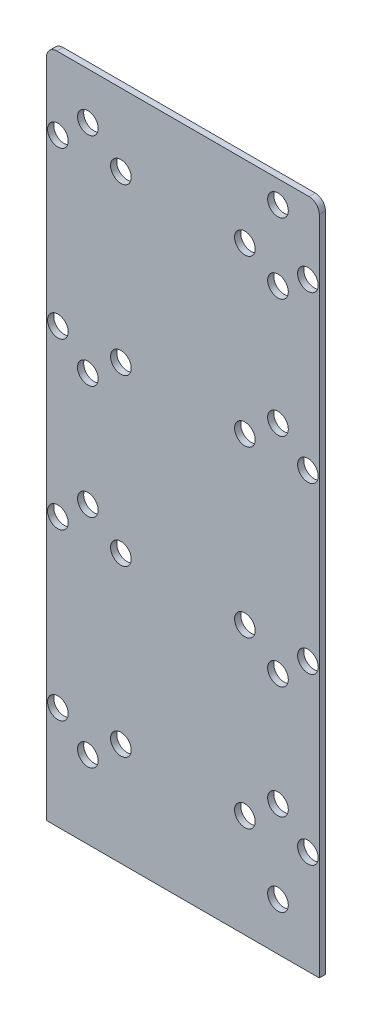
ISO-10303-21;
HEADER;
FILE_DESCRIPTION(('STEP AP214'),'2;1');
FILE_NAME('part.step','',(''),(''),'','','');
FILE_SCHEMA(('AUTOMOTIVE_DESIGN { 1 0 10303 214 1 1 1 1 }'));
ENDSEC;
DATA;
#1=APPLICATION_CONTEXT('core data for automotive mechanical design processes');
#2=APPLICATION_PROTOCOL_DEFINITION('international standard','automotive_design',2000,#1);
#3=PRODUCT_CONTEXT('',#1,'mechanical');
#4=PRODUCT('Part','Part','',(#3));
#5=PRODUCT_RELATED_PRODUCT_CATEGORY('part','',(#4));
#6=PRODUCT_DEFINITION_FORMATION('','',#4);
#7=PRODUCT_DEFINITION_CONTEXT('part definition',#1,'design');
#8=PRODUCT_DEFINITION('design','',#6,#7);
#9=PRODUCT_DEFINITION_SHAPE('','',#8);
#10=(LENGTH_UNIT() NAMED_UNIT(*) SI_UNIT(.MILLI.,.METRE.));
#11=(NAMED_UNIT(*) PLANE_ANGLE_UNIT() SI_UNIT($,.RADIAN.));
#12=(NAMED_UNIT(*) SI_UNIT($,.STERADIAN.) SOLID_ANGLE_UNIT());
#13=UNCERTAINTY_MEASURE_WITH_UNIT(LENGTH_MEASURE(1.E-05),#10,'distance_accuracy_value','');
#14=(GEOMETRIC_REPRESENTATION_CONTEXT(3) GLOBAL_UNCERTAINTY_ASSIGNED_CONTEXT((#13)) GLOBAL_UNIT_ASSIGNED_CONTEXT((#10,
#11,#12)) REPRESENTATION_CONTEXT('',''));
#15=CARTESIAN_POINT('',(0.,0.,0.));
#16=DIRECTION('',(0.,0.,1.));
#17=DIRECTION('',(1.,0.,0.));
#18=AXIS2_PLACEMENT_3D('',#15,#16,#17);
#19=CARTESIAN_POINT('',(-5.14882004531545,493.39742900995,-7.));
#20=DIRECTION('',(0.,0.,1.));
#21=DIRECTION('',(1.,0.,0.));
#22=AXIS2_PLACEMENT_3D('',#19,#20,#21);
#23=CYLINDRICAL_SURFACE('',#22,5.00000000000001);
#24=CARTESIAN_POINT('',(-5.14882004531545,493.39742900995,3.));
#25=DIRECTION('',(0.,0.,1.));
#26=DIRECTION('',(1.,0.,0.));
#27=AXIS2_PLACEMENT_3D('',#24,#25,#26);
#28=CIRCLE('',#27,5.00000000000001);
#29=CARTESIAN_POINT('',(-0.148820045315442,493.39742900995,3.));
#30=VERTEX_POINT('',#29);
#31=EDGE_CURVE('E169',#30,#30,#28,.T.);
#32=ORIENTED_EDGE('',*,*,#31,.T.);
#33=EDGE_LOOP('',(#32));
#34=FACE_BOUND('',#33,.T.);
#35=CARTESIAN_POINT('',(-5.14882004531545,493.39742900995,0.));
#36=DIRECTION('',(0.,0.,1.));
#37=DIRECTION('',(1.,0.,0.));
#38=AXIS2_PLACEMENT_3D('',#35,#36,#37);
#39=CIRCLE('',#38,5.00000000000001);
#40=CARTESIAN_POINT('',(-0.148820045315442,493.39742900995,0.));
#41=VERTEX_POINT('',#40);
#42=EDGE_CURVE('E172',#41,#41,#39,.T.);
#43=ORIENTED_EDGE('',*,*,#42,.F.);
#44=EDGE_LOOP('',(#43));
#45=FACE_BOUND('',#44,.T.);
#46=ADVANCED_FACE('F39',(#34,#45),#23,.F.);
#47=CARTESIAN_POINT('',(-5.14882004531544,413.39742900995,-7.));
#48=DIRECTION('',(0.,0.,1.));
#49=DIRECTION('',(1.,0.,0.));
#50=AXIS2_PLACEMENT_3D('',#47,#48,#49);
#51=CYLINDRICAL_SURFACE('',#50,5.00000000000001);
#52=CARTESIAN_POINT('',(-5.14882004531544,413.39742900995,3.));
#53=DIRECTION('',(0.,0.,1.));
#54=DIRECTION('',(1.,0.,0.));
#55=AXIS2_PLACEMENT_3D('',#52,#53,#54);
#56=CIRCLE('',#55,5.00000000000001);
#57=CARTESIAN_POINT('',(-0.148820045315432,413.39742900995,3.));
#58=VERTEX_POINT('',#57);
#59=EDGE_CURVE('E163',#58,#58,#56,.T.);
#60=ORIENTED_EDGE('',*,*,#59,.T.);
#61=EDGE_LOOP('',(#60));
#62=FACE_BOUND('',#61,.T.);
#63=CARTESIAN_POINT('',(-5.14882004531544,413.39742900995,0.));
#64=DIRECTION('',(0.,0.,1.));
#65=DIRECTION('',(1.,0.,0.));
#66=AXIS2_PLACEMENT_3D('',#63,#64,#65);
#67=CIRCLE('',#66,5.00000000000001);
#68=CARTESIAN_POINT('',(-0.148820045315432,413.39742900995,0.));
#69=VERTEX_POINT('',#68);
#70=EDGE_CURVE('E166',#69,#69,#67,.T.);
#71=ORIENTED_EDGE('',*,*,#70,.F.);
#72=EDGE_LOOP('',(#71));
#73=FACE_BOUND('',#72,.T.);
#74=ADVANCED_FACE('F209',(#62,#73),#51,.F.);
#75=CARTESIAN_POINT('',(54.8511799546846,493.39742900995,-7.));
#76=DIRECTION('',(0.,0.,1.));
#77=DIRECTION('',(1.,0.,0.));
#78=AXIS2_PLACEMENT_3D('',#75,#76,#77);
#79=CYLINDRICAL_SURFACE('',#78,5.);
#80=CARTESIAN_POINT('',(54.8511799546846,493.39742900995,3.));
#81=DIRECTION('',(0.,0.,1.));
#82=DIRECTION('',(1.,0.,0.));
#83=AXIS2_PLACEMENT_3D('',#80,#81,#82);
#84=CIRCLE('',#83,5.);
#85=CARTESIAN_POINT('',(59.8511799546846,493.39742900995,3.));
#86=VERTEX_POINT('',#85);
#87=EDGE_CURVE('E157',#86,#86,#84,.T.);
#88=ORIENTED_EDGE('',*,*,#87,.T.);
#89=EDGE_LOOP('',(#88));
#90=FACE_BOUND('',#89,.T.);
#91=CARTESIAN_POINT('',(54.8511799546846,493.39742900995,0.));
#92=DIRECTION('',(0.,0.,1.));
#93=DIRECTION('',(1.,0.,0.));
#94=AXIS2_PLACEMENT_3D('',#91,#92,#93);
#95=CIRCLE('',#94,5.);
#96=CARTESIAN_POINT('',(59.8511799546846,493.39742900995,0.));
#97=VERTEX_POINT('',#96);
#98=EDGE_CURVE('E160',#97,#97,#95,.T.);
#99=ORIENTED_EDGE('',*,*,#98,.F.);
#100=EDGE_LOOP('',(#99));
#101=FACE_BOUND('',#100,.T.);
#102=ADVANCED_FACE('F215',(#90,#101),#79,.F.);
#103=CARTESIAN_POINT('',(54.8511799546846,413.39742900995,-7.));
#104=DIRECTION('',(0.,0.,1.));
#105=DIRECTION('',(1.,0.,0.));
#106=AXIS2_PLACEMENT_3D('',#103,#104,#105);
#107=CYLINDRICAL_SURFACE('',#106,5.);
#108=CARTESIAN_POINT('',(54.8511799546846,413.39742900995,3.));
#109=DIRECTION('',(0.,0.,1.));
#110=DIRECTION('',(1.,0.,0.));
#111=AXIS2_PLACEMENT_3D('',#108,#109,#110);
#112=CIRCLE('',#111,5.);
#113=CARTESIAN_POINT('',(59.8511799546846,413.39742900995,3.));
#114=VERTEX_POINT('',#113);
#115=EDGE_CURVE('E151',#114,#114,#112,.T.);
#116=ORIENTED_EDGE('',*,*,#115,.T.);
#117=EDGE_LOOP('',(#116));
#118=FACE_BOUND('',#117,.T.);
#119=CARTESIAN_POINT('',(54.8511799546846,413.39742900995,0.));
#120=DIRECTION('',(0.,0.,1.));
#121=DIRECTION('',(1.,0.,0.));
#122=AXIS2_PLACEMENT_3D('',#119,#120,#121);
#123=CIRCLE('',#122,5.);
#124=CARTESIAN_POINT('',(59.8511799546846,413.39742900995,0.));
#125=VERTEX_POINT('',#124);
#126=EDGE_CURVE('E154',#125,#125,#123,.T.);
#127=ORIENTED_EDGE('',*,*,#126,.F.);
#128=EDGE_LOOP('',(#127));
#129=FACE_BOUND('',#128,.T.);
#130=ADVANCED_FACE('F222',(#118,#129),#107,.F.);
#131=CARTESIAN_POINT('',(85.3511799546846,493.39742900995,-7.));
#132=DIRECTION('',(0.,0.,1.));
#133=DIRECTION('',(1.,0.,0.));
#134=AXIS2_PLACEMENT_3D('',#131,#132,#133);
#135=CYLINDRICAL_SURFACE('',#134,5.00000000000001);
#136=CARTESIAN_POINT('',(85.3511799546846,493.39742900995,3.));
#137=DIRECTION('',(0.,0.,1.));
#138=DIRECTION('',(1.,0.,0.));
#139=AXIS2_PLACEMENT_3D('',#136,#137,#138);
#140=CIRCLE('',#139,5.00000000000001);
#141=CARTESIAN_POINT('',(90.3511799546846,493.39742900995,3.));
#142=VERTEX_POINT('',#141);
#143=EDGE_CURVE('E145',#142,#142,#140,.T.);
#144=ORIENTED_EDGE('',*,*,#143,.T.);
#145=EDGE_LOOP('',(#144));
#146=FACE_BOUND('',#145,.T.);
#147=CARTESIAN_POINT('',(85.3511799546846,493.39742900995,0.));
#148=DIRECTION('',(0.,0.,1.));
#149=DIRECTION('',(1.,0.,0.));
#150=AXIS2_PLACEMENT_3D('',#147,#148,#149);
#151=CIRCLE('',#150,5.00000000000001);
#152=CARTESIAN_POINT('',(90.3511799546846,493.39742900995,0.));
#153=VERTEX_POINT('',#152);
#154=EDGE_CURVE('E148',#153,#153,#151,.T.);
#155=ORIENTED_EDGE('',*,*,#154,.F.);
#156=EDGE_LOOP('',(#155));
#157=FACE_BOUND('',#156,.T.);
#158=ADVANCED_FACE('F226',(#146,#157),#135,.F.);
#159=CARTESIAN_POINT('',(85.3511799546846,413.39742900995,-7.));
#160=DIRECTION('',(0.,0.,1.));
#161=DIRECTION('',(1.,0.,0.));
#162=AXIS2_PLACEMENT_3D('',#159,#160,#161);
#163=CYLINDRICAL_SURFACE('',#162,5.00000000000001);
#164=CARTESIAN_POINT('',(85.3511799546846,413.39742900995,3.));
#165=DIRECTION('',(0.,0.,1.));
#166=DIRECTION('',(1.,0.,0.));
#167=AXIS2_PLACEMENT_3D('',#164,#165,#166);
#168=CIRCLE('',#167,5.00000000000001);
#169=CARTESIAN_POINT('',(90.3511799546846,413.39742900995,3.));
#170=VERTEX_POINT('',#169);
#171=EDGE_CURVE('E139',#170,#170,#168,.T.);
#172=ORIENTED_EDGE('',*,*,#171,.T.);
#173=EDGE_LOOP('',(#172));
#174=FACE_BOUND('',#173,.T.);
#175=CARTESIAN_POINT('',(85.3511799546846,413.39742900995,0.));
#176=DIRECTION('',(0.,0.,1.));
#177=DIRECTION('',(1.,0.,0.));
#178=AXIS2_PLACEMENT_3D('',#175,#176,#177);
#179=CIRCLE('',#178,5.00000000000001);
#180=CARTESIAN_POINT('',(90.3511799546846,413.39742900995,0.));
#181=VERTEX_POINT('',#180);
#182=EDGE_CURVE('E142',#181,#181,#179,.T.);
#183=ORIENTED_EDGE('',*,*,#182,.F.);
#184=EDGE_LOOP('',(#183));
#185=FACE_BOUND('',#184,.T.);
#186=ADVANCED_FACE('F230',(#174,#185),#163,.F.);
#187=CARTESIAN_POINT('',(-35.6488200453154,493.39742900995,-7.));
#188=DIRECTION('',(0.,0.,1.));
#189=DIRECTION('',(1.,0.,0.));
#190=AXIS2_PLACEMENT_3D('',#187,#188,#189);
#191=CYLINDRICAL_SURFACE('',#190,5.);
#192=CARTESIAN_POINT('',(-35.6488200453154,493.39742900995,3.));
#193=DIRECTION('',(0.,0.,1.));
#194=DIRECTION('',(1.,0.,0.));
#195=AXIS2_PLACEMENT_3D('',#192,#193,#194);
#196=CIRCLE('',#195,5.);
#197=CARTESIAN_POINT('',(-30.6488200453154,493.39742900995,3.));
#198=VERTEX_POINT('',#197);
#199=EDGE_CURVE('E133',#198,#198,#196,.T.);
#200=ORIENTED_EDGE('',*,*,#199,.T.);
#201=EDGE_LOOP('',(#200));
#202=FACE_BOUND('',#201,.T.);
#203=CARTESIAN_POINT('',(-35.6488200453154,493.39742900995,0.));
#204=DIRECTION('',(0.,0.,1.));
#205=DIRECTION('',(1.,0.,0.));
#206=AXIS2_PLACEMENT_3D('',#203,#204,#205);
#207=CIRCLE('',#206,5.);
#208=CARTESIAN_POINT('',(-30.6488200453154,493.39742900995,0.));
#209=VERTEX_POINT('',#208);
#210=EDGE_CURVE('E136',#209,#209,#207,.T.);
#211=ORIENTED_EDGE('',*,*,#210,.F.);
#212=EDGE_LOOP('',(#211));
#213=FACE_BOUND('',#212,.T.);
#214=ADVANCED_FACE('F234',(#202,#213),#191,.F.);
#215=CARTESIAN_POINT('',(-35.6488200453154,413.39742900995,-7.));
#216=DIRECTION('',(0.,0.,1.));
#217=DIRECTION('',(1.,0.,0.));
#218=AXIS2_PLACEMENT_3D('',#215,#216,#217);
#219=CYLINDRICAL_SURFACE('',#218,5.);
#220=CARTESIAN_POINT('',(-35.6488200453154,413.39742900995,3.));
#221=DIRECTION('',(0.,0.,1.));
#222=DIRECTION('',(1.,0.,0.));
#223=AXIS2_PLACEMENT_3D('',#220,#221,#222);
#224=CIRCLE('',#223,5.);
#225=CARTESIAN_POINT('',(-30.6488200453154,413.39742900995,3.));
#226=VERTEX_POINT('',#225);
#227=EDGE_CURVE('E126',#226,#226,#224,.T.);
#228=ORIENTED_EDGE('',*,*,#227,.T.);
#229=EDGE_LOOP('',(#228));
#230=FACE_BOUND('',#229,.T.);
#231=CARTESIAN_POINT('',(-35.6488200453154,413.39742900995,0.));
#232=DIRECTION('',(0.,0.,1.));
#233=DIRECTION('',(1.,0.,0.));
#234=AXIS2_PLACEMENT_3D('',#231,#232,#233);
#235=CIRCLE('',#234,5.);
#236=CARTESIAN_POINT('',(-30.6488200453154,413.39742900995,0.));
#237=VERTEX_POINT('',#236);
#238=EDGE_CURVE('E130',#237,#237,#235,.T.);
#239=ORIENTED_EDGE('',*,*,#238,.F.);
#240=EDGE_LOOP('',(#239));
#241=FACE_BOUND('',#240,.T.);
#242=ADVANCED_FACE('F238',(#230,#241),#219,.F.);
#243=CARTESIAN_POINT('',(-41.1488200453155,528.39742900995,0.));
#244=DIRECTION('',(-1.,0.,0.));
#245=DIRECTION('',(0.,-1.,0.));
#246=AXIS2_PLACEMENT_3D('',#243,#244,#245);
#247=PLANE('',#246);
#248=DIRECTION('',(0.,-1.,0.));
#249=VECTOR('',#248,1.);
#250=CARTESIAN_POINT('',(-41.1488200453155,528.39742900995,3.));
#251=LINE('',#250,#249);
#252=CARTESIAN_POINT('',(-41.1488200453155,523.39742900995,3.));
#253=VERTEX_POINT('',#252);
#254=CARTESIAN_POINT('',(-41.1488200453154,203.39742900995,3.));
#255=VERTEX_POINT('',#254);
#256=EDGE_CURVE('E117',#253,#255,#251,.T.);
#257=ORIENTED_EDGE('',*,*,#256,.F.);
#258=DIRECTION('',(0.,0.,1.));
#259=VECTOR('',#258,1.);
#260=CARTESIAN_POINT('',(-41.1488200453155,523.39742900995,0.));
#261=LINE('',#260,#259);
#262=CARTESIAN_POINT('',(-41.1488200453155,523.39742900995,0.));
#263=VERTEX_POINT('',#262);
#264=EDGE_CURVE('E11',#253,#263,#261,.F.);
#265=ORIENTED_EDGE('',*,*,#264,.T.);
#266=DIRECTION('',(0.,-1.,0.));
#267=VECTOR('',#266,1.);
#268=CARTESIAN_POINT('',(-41.1488200453155,528.39742900995,0.));
#269=LINE('',#268,#267);
#270=CARTESIAN_POINT('',(-41.1488200453154,203.39742900995,0.));
#271=VERTEX_POINT('',#270);
#272=EDGE_CURVE('E90',#263,#271,#269,.T.);
#273=ORIENTED_EDGE('',*,*,#272,.T.);
#274=DIRECTION('',(0.,0.,1.));
#275=VECTOR('',#274,1.);
#276=CARTESIAN_POINT('',(-41.1488200453154,203.39742900995,0.));
#277=LINE('',#276,#275);
#278=EDGE_CURVE('E93',#271,#255,#277,.T.);
#279=ORIENTED_EDGE('',*,*,#278,.T.);
#280=EDGE_LOOP('',(#257,#265,#273,#279));
#281=FACE_BOUND('',#280,.T.);
#282=ADVANCED_FACE('F92',(#281),#247,.T.);
#283=CARTESIAN_POINT('',(-41.1488200453155,528.39742900995,0.));
#284=DIRECTION('',(0.,1.,0.));
#285=DIRECTION('',(0.,0.,1.));
#286=AXIS2_PLACEMENT_3D('',#283,#284,#285);
#287=PLANE('',#286);
#288=DIRECTION('',(-1.,0.,0.));
#289=VECTOR('',#288,1.);
#290=CARTESIAN_POINT('',(-41.1488200453155,528.39742900995,3.));
#291=LINE('',#290,#289);
#292=CARTESIAN_POINT('',(85.8511799546845,528.39742900995,3.));
#293=VERTEX_POINT('',#292);
#294=CARTESIAN_POINT('',(-36.1488200453155,528.39742900995,3.));
#295=VERTEX_POINT('',#294);
#296=EDGE_CURVE('E97',#293,#295,#291,.T.);
#297=ORIENTED_EDGE('',*,*,#296,.F.);
#298=DIRECTION('',(0.,0.,1.));
#299=VECTOR('',#298,1.);
#300=CARTESIAN_POINT('',(85.8511799546845,528.39742900995,0.));
#301=LINE('',#300,#299);
#302=CARTESIAN_POINT('',(85.8511799546845,528.39742900995,0.));
#303=VERTEX_POINT('',#302);
#304=EDGE_CURVE('E185',#293,#303,#301,.F.);
#305=ORIENTED_EDGE('',*,*,#304,.T.);
#306=DIRECTION('',(-1.,0.,0.));
#307=VECTOR('',#306,1.);
#308=CARTESIAN_POINT('',(-41.1488200453155,528.39742900995,0.));
#309=LINE('',#308,#307);
#310=CARTESIAN_POINT('',(-36.1488200453155,528.39742900995,0.));
#311=VERTEX_POINT('',#310);
#312=EDGE_CURVE('E105',#303,#311,#309,.T.);
#313=ORIENTED_EDGE('',*,*,#312,.T.);
#314=DIRECTION('',(0.,0.,1.));
#315=VECTOR('',#314,1.);
#316=CARTESIAN_POINT('',(-36.1488200453155,528.39742900995,0.));
#317=LINE('',#316,#315);
#318=EDGE_CURVE('E182',#311,#295,#317,.T.);
#319=ORIENTED_EDGE('',*,*,#318,.T.);
#320=EDGE_LOOP('',(#297,#305,#313,#319));
#321=FACE_BOUND('',#320,.T.);
#322=ADVANCED_FACE('F200',(#321),#287,.T.);
#323=CARTESIAN_POINT('',(90.8511799546846,528.39742900995,0.));
#324=DIRECTION('',(1.,0.,0.));
#325=DIRECTION('',(0.,1.,0.));
#326=AXIS2_PLACEMENT_3D('',#323,#324,#325);
#327=PLANE('',#326);
#328=DIRECTION('',(0.,1.,0.));
#329=VECTOR('',#328,1.);
#330=CARTESIAN_POINT('',(90.8511799546846,528.39742900995,0.));
#331=LINE('',#330,#329);
#332=CARTESIAN_POINT('',(90.8511799546846,203.39742900995,0.));
#333=VERTEX_POINT('',#332);
#334=CARTESIAN_POINT('',(90.8511799546846,523.39742900995,0.));
#335=VERTEX_POINT('',#334);
#336=EDGE_CURVE('E111',#333,#335,#331,.T.);
#337=ORIENTED_EDGE('',*,*,#336,.T.);
#338=DIRECTION('',(0.,0.,1.));
#339=VECTOR('',#338,1.);
#340=CARTESIAN_POINT('',(90.8511799546846,523.39742900995,0.));
#341=LINE('',#340,#339);
#342=CARTESIAN_POINT('',(90.8511799546846,523.39742900995,3.));
#343=VERTEX_POINT('',#342);
#344=EDGE_CURVE('E175',#335,#343,#341,.T.);
#345=ORIENTED_EDGE('',*,*,#344,.T.);
#346=DIRECTION('',(0.,1.,0.));
#347=VECTOR('',#346,1.);
#348=CARTESIAN_POINT('',(90.8511799546846,528.39742900995,3.));
#349=LINE('',#348,#347);
#350=CARTESIAN_POINT('',(90.8511799546846,203.39742900995,3.));
#351=VERTEX_POINT('',#350);
#352=EDGE_CURVE('E121',#351,#343,#349,.T.);
#353=ORIENTED_EDGE('',*,*,#352,.F.);
#354=DIRECTION('',(0.,0.,1.));
#355=VECTOR('',#354,1.);
#356=CARTESIAN_POINT('',(90.8511799546846,203.39742900995,0.));
#357=LINE('',#356,#355);
#358=EDGE_CURVE('E104',#333,#351,#357,.T.);
#359=ORIENTED_EDGE('',*,*,#358,.F.);
#360=EDGE_LOOP('',(#337,#345,#353,#359));
#361=FACE_BOUND('',#360,.T.);
#362=ADVANCED_FACE('F192',(#361),#327,.T.);
#363=CARTESIAN_POINT('',(-41.1488200453154,203.39742900995,0.));
#364=DIRECTION('',(0.,-1.,0.));
#365=DIRECTION('',(0.,0.,-1.));
#366=AXIS2_PLACEMENT_3D('',#363,#364,#365);
#367=PLANE('',#366);
#368=DIRECTION('',(1.,0.,0.));
#369=VECTOR('',#368,1.);
#370=CARTESIAN_POINT('',(-41.1488200453154,203.39742900995,3.));
#371=LINE('',#370,#369);
#372=EDGE_CURVE('E103',#255,#351,#371,.T.);
#373=ORIENTED_EDGE('',*,*,#372,.F.);
#374=ORIENTED_EDGE('',*,*,#278,.F.);
#375=DIRECTION('',(1.,0.,0.));
#376=VECTOR('',#375,1.);
#377=CARTESIAN_POINT('',(-41.1488200453154,203.39742900995,0.));
#378=LINE('',#377,#376);
#379=EDGE_CURVE('E96',#271,#333,#378,.T.);
#380=ORIENTED_EDGE('',*,*,#379,.T.);
#381=ORIENTED_EDGE('',*,*,#358,.T.);
#382=EDGE_LOOP('',(#373,#374,#380,#381));
#383=FACE_BOUND('',#382,.T.);
#384=ADVANCED_FACE('F101',(#383),#367,.T.);
#385=CARTESIAN_POINT('',(0.,0.,0.));
#386=DIRECTION('',(0.,0.,1.));
#387=DIRECTION('',(1.,0.,0.));
#388=AXIS2_PLACEMENT_3D('',#385,#386,#387);
#389=PLANE('',#388);
#390=CARTESIAN_POINT('',(-5.14882004531543,333.39742900995,0.));
#391=DIRECTION('',(0.,0.,1.));
#392=DIRECTION('',(1.,0.,0.));
#393=AXIS2_PLACEMENT_3D('',#390,#391,#392);
#394=CIRCLE('',#393,5.00000000000001);
#395=CARTESIAN_POINT('',(-0.148820045315422,333.39742900995,0.));
#396=VERTEX_POINT('',#395);
#397=EDGE_CURVE('E335',#396,#396,#394,.T.);
#398=ORIENTED_EDGE('',*,*,#397,.T.);
#399=EDGE_LOOP('',(#398));
#400=FACE_BOUND('',#399,.T.);
#401=CARTESIAN_POINT('',(54.8511799546846,333.39742900995,0.));
#402=DIRECTION('',(0.,0.,1.));
#403=DIRECTION('',(1.,0.,0.));
#404=AXIS2_PLACEMENT_3D('',#401,#402,#403);
#405=CIRCLE('',#404,5.);
#406=CARTESIAN_POINT('',(59.8511799546846,333.39742900995,0.));
#407=VERTEX_POINT('',#406);
#408=EDGE_CURVE('E339',#407,#407,#405,.T.);
#409=ORIENTED_EDGE('',*,*,#408,.T.);
#410=EDGE_LOOP('',(#409));
#411=FACE_BOUND('',#410,.T.);
#412=CARTESIAN_POINT('',(85.3511799546846,333.39742900995,0.));
#413=DIRECTION('',(0.,0.,1.));
#414=DIRECTION('',(1.,0.,0.));
#415=AXIS2_PLACEMENT_3D('',#412,#413,#414);
#416=CIRCLE('',#415,5.00000000000001);
#417=CARTESIAN_POINT('',(90.3511799546846,333.39742900995,0.));
#418=VERTEX_POINT('',#417);
#419=EDGE_CURVE('E348',#418,#418,#416,.T.);
#420=ORIENTED_EDGE('',*,*,#419,.T.);
#421=EDGE_LOOP('',(#420));
#422=FACE_BOUND('',#421,.T.);
#423=CARTESIAN_POINT('',(-35.6488200453154,333.39742900995,0.));
#424=DIRECTION('',(0.,0.,1.));
#425=DIRECTION('',(1.,0.,0.));
#426=AXIS2_PLACEMENT_3D('',#423,#424,#425);
#427=CIRCLE('',#426,5.);
#428=CARTESIAN_POINT('',(-30.6488200453154,333.39742900995,0.));
#429=VERTEX_POINT('',#428);
#430=EDGE_CURVE('E354',#429,#429,#427,.T.);
#431=ORIENTED_EDGE('',*,*,#430,.T.);
#432=EDGE_LOOP('',(#431));
#433=FACE_BOUND('',#432,.T.);
#434=CARTESIAN_POINT('',(-35.6488200453154,253.39742900995,0.));
#435=DIRECTION('',(0.,0.,1.));
#436=DIRECTION('',(1.,0.,0.));
#437=AXIS2_PLACEMENT_3D('',#434,#435,#436);
#438=CIRCLE('',#437,5.);
#439=CARTESIAN_POINT('',(-30.6488200453154,253.39742900995,0.));
#440=VERTEX_POINT('',#439);
#441=EDGE_CURVE('E378',#440,#440,#438,.T.);
#442=ORIENTED_EDGE('',*,*,#441,.T.);
#443=EDGE_LOOP('',(#442));
#444=FACE_BOUND('',#443,.T.);
#445=CARTESIAN_POINT('',(-5.14882004531542,253.39742900995,0.));
#446=DIRECTION('',(0.,0.,1.));
#447=DIRECTION('',(1.,0.,0.));
#448=AXIS2_PLACEMENT_3D('',#445,#446,#447);
#449=CIRCLE('',#448,5.00000000000001);
#450=CARTESIAN_POINT('',(-0.148820045315411,253.39742900995,0.));
#451=VERTEX_POINT('',#450);
#452=EDGE_CURVE('E375',#451,#451,#449,.T.);
#453=ORIENTED_EDGE('',*,*,#452,.T.);
#454=EDGE_LOOP('',(#453));
#455=FACE_BOUND('',#454,.T.);
#456=CARTESIAN_POINT('',(54.8511799546846,253.39742900995,0.));
#457=DIRECTION('',(0.,0.,1.));
#458=DIRECTION('',(1.,0.,0.));
#459=AXIS2_PLACEMENT_3D('',#456,#457,#458);
#460=CIRCLE('',#459,5.);
#461=CARTESIAN_POINT('',(59.8511799546846,253.39742900995,0.));
#462=VERTEX_POINT('',#461);
#463=EDGE_CURVE('E372',#462,#462,#460,.T.);
#464=ORIENTED_EDGE('',*,*,#463,.T.);
#465=EDGE_LOOP('',(#464));
#466=FACE_BOUND('',#465,.T.);
#467=CARTESIAN_POINT('',(85.3511799546846,253.39742900995,0.));
#468=DIRECTION('',(0.,0.,1.));
#469=DIRECTION('',(1.,0.,0.));
#470=AXIS2_PLACEMENT_3D('',#467,#468,#469);
#471=CIRCLE('',#470,5.00000000000001);
#472=CARTESIAN_POINT('',(90.3511799546846,253.39742900995,0.));
#473=VERTEX_POINT('',#472);
#474=EDGE_CURVE('E361',#473,#473,#471,.T.);
#475=ORIENTED_EDGE('',*,*,#474,.T.);
#476=EDGE_LOOP('',(#475));
#477=FACE_BOUND('',#476,.T.);
#478=CARTESIAN_POINT('',(-21.1488200453155,505.89742900995,0.));
#479=DIRECTION('',(0.,0.,1.));
#480=DIRECTION('',(1.,0.,0.));
#481=AXIS2_PLACEMENT_3D('',#478,#479,#480);
#482=CIRCLE('',#481,5.00000000000001);
#483=CARTESIAN_POINT('',(-16.1488200453155,505.89742900995,0.));
#484=VERTEX_POINT('',#483);
#485=EDGE_CURVE('E402',#484,#484,#482,.T.);
#486=ORIENTED_EDGE('',*,*,#485,.T.);
#487=EDGE_LOOP('',(#486));
#488=FACE_BOUND('',#487,.T.);
#489=CARTESIAN_POINT('',(-21.1488200453155,400.89742900995,0.));
#490=DIRECTION('',(0.,0.,1.));
#491=DIRECTION('',(1.,0.,0.));
#492=AXIS2_PLACEMENT_3D('',#489,#490,#491);
#493=CIRCLE('',#492,5.00000000000001);
#494=CARTESIAN_POINT('',(-16.1488200453154,400.89742900995,0.));
#495=VERTEX_POINT('',#494);
#496=EDGE_CURVE('E399',#495,#495,#493,.T.);
#497=ORIENTED_EDGE('',*,*,#496,.T.);
#498=EDGE_LOOP('',(#497));
#499=FACE_BOUND('',#498,.T.);
#500=CARTESIAN_POINT('',(-21.1488200453154,345.89742900995,0.));
#501=DIRECTION('',(0.,0.,1.));
#502=DIRECTION('',(1.,0.,0.));
#503=AXIS2_PLACEMENT_3D('',#500,#501,#502);
#504=CIRCLE('',#503,5.00000000000001);
#505=CARTESIAN_POINT('',(-16.1488200453154,345.89742900995,0.));
#506=VERTEX_POINT('',#505);
#507=EDGE_CURVE('E396',#506,#506,#504,.T.);
#508=ORIENTED_EDGE('',*,*,#507,.T.);
#509=EDGE_LOOP('',(#508));
#510=FACE_BOUND('',#509,.T.);
#511=CARTESIAN_POINT('',(-21.1488200453154,240.89742900995,0.));
#512=DIRECTION('',(0.,0.,1.));
#513=DIRECTION('',(1.,0.,0.));
#514=AXIS2_PLACEMENT_3D('',#511,#512,#513);
#515=CIRCLE('',#514,5.00000000000001);
#516=CARTESIAN_POINT('',(-16.1488200453154,240.89742900995,0.));
#517=VERTEX_POINT('',#516);
#518=EDGE_CURVE('E385',#517,#517,#515,.T.);
#519=ORIENTED_EDGE('',*,*,#518,.T.);
#520=EDGE_LOOP('',(#519));
#521=FACE_BOUND('',#520,.T.);
#522=CARTESIAN_POINT('',(70.8511799546846,517.39742900995,0.));
#523=DIRECTION('',(0.,0.,1.));
#524=DIRECTION('',(1.,0.,0.));
#525=AXIS2_PLACEMENT_3D('',#522,#523,#524);
#526=CIRCLE('',#525,5.00000000000001);
#527=CARTESIAN_POINT('',(75.8511799546846,517.39742900995,0.));
#528=VERTEX_POINT('',#527);
#529=EDGE_CURVE('E119',#528,#528,#526,.T.);
#530=ORIENTED_EDGE('',*,*,#529,.T.);
#531=EDGE_LOOP('',(#530));
#532=FACE_BOUND('',#531,.T.);
#533=CARTESIAN_POINT('',(70.8511799546846,483.39742900995,0.));
#534=DIRECTION('',(0.,0.,1.));
#535=DIRECTION('',(1.,0.,0.));
#536=AXIS2_PLACEMENT_3D('',#533,#534,#535);
#537=CIRCLE('',#536,5.00000000000001);
#538=CARTESIAN_POINT('',(75.8511799546846,483.39742900995,0.));
#539=VERTEX_POINT('',#538);
#540=EDGE_CURVE('E411',#539,#539,#537,.T.);
#541=ORIENTED_EDGE('',*,*,#540,.T.);
#542=EDGE_LOOP('',(#541));
#543=FACE_BOUND('',#542,.T.);
#544=CARTESIAN_POINT('',(70.8511799546846,425.89742900995,0.));
#545=DIRECTION('',(0.,0.,1.));
#546=DIRECTION('',(1.,0.,0.));
#547=AXIS2_PLACEMENT_3D('',#544,#545,#546);
#548=CIRCLE('',#547,5.00000000000001);
#549=CARTESIAN_POINT('',(75.8511799546846,425.89742900995,0.));
#550=VERTEX_POINT('',#549);
#551=EDGE_CURVE('E417',#550,#550,#548,.T.);
#552=ORIENTED_EDGE('',*,*,#551,.T.);
#553=EDGE_LOOP('',(#552));
#554=FACE_BOUND('',#553,.T.);
#555=CARTESIAN_POINT('',(70.8511799546846,320.89742900995,0.));
#556=DIRECTION('',(0.,0.,1.));
#557=DIRECTION('',(1.,0.,0.));
#558=AXIS2_PLACEMENT_3D('',#555,#556,#557);
#559=CIRCLE('',#558,5.00000000000001);
#560=CARTESIAN_POINT('',(75.8511799546846,320.89742900995,0.));
#561=VERTEX_POINT('',#560);
#562=EDGE_CURVE('E423',#561,#561,#559,.T.);
#563=ORIENTED_EDGE('',*,*,#562,.T.);
#564=EDGE_LOOP('',(#563));
#565=FACE_BOUND('',#564,.T.);
#566=CARTESIAN_POINT('',(70.8511799546846,266.39742900995,0.));
#567=DIRECTION('',(0.,0.,1.));
#568=DIRECTION('',(1.,0.,0.));
#569=AXIS2_PLACEMENT_3D('',#566,#567,#568);
#570=CIRCLE('',#569,5.00000000000001);
#571=CARTESIAN_POINT('',(75.8511799546846,266.39742900995,0.));
#572=VERTEX_POINT('',#571);
#573=EDGE_CURVE('E429',#572,#572,#570,.T.);
#574=ORIENTED_EDGE('',*,*,#573,.T.);
#575=EDGE_LOOP('',(#574));
#576=FACE_BOUND('',#575,.T.);
#577=CARTESIAN_POINT('',(70.8511799546846,226.39742900995,0.));
#578=DIRECTION('',(0.,0.,1.));
#579=DIRECTION('',(1.,0.,0.));
#580=AXIS2_PLACEMENT_3D('',#577,#578,#579);
#581=CIRCLE('',#580,5.00000000000001);
#582=CARTESIAN_POINT('',(75.8511799546846,226.39742900995,0.));
#583=VERTEX_POINT('',#582);
#584=EDGE_CURVE('E435',#583,#583,#581,.T.);
#585=ORIENTED_EDGE('',*,*,#584,.T.);
#586=EDGE_LOOP('',(#585));
#587=FACE_BOUND('',#586,.T.);
#588=ORIENTED_EDGE('',*,*,#312,.F.);
#589=CARTESIAN_POINT('',(85.8511799546846,523.39742900995,0.));
#590=DIRECTION('',(0.,0.,1.));
#591=DIRECTION('',(1.,0.,0.));
#592=AXIS2_PLACEMENT_3D('',#589,#590,#591);
#593=CIRCLE('',#592,5.);
#594=EDGE_CURVE('E47',#303,#335,#593,.F.);
#595=ORIENTED_EDGE('',*,*,#594,.T.);
#596=ORIENTED_EDGE('',*,*,#336,.F.);
#597=ORIENTED_EDGE('',*,*,#379,.F.);
#598=ORIENTED_EDGE('',*,*,#272,.F.);
#599=CARTESIAN_POINT('',(-36.1488200453155,523.39742900995,0.));
#600=DIRECTION('',(0.,0.,1.));
#601=DIRECTION('',(1.,0.,0.));
#602=AXIS2_PLACEMENT_3D('',#599,#600,#601);
#603=CIRCLE('',#602,5.);
#604=EDGE_CURVE('E59',#263,#311,#603,.F.);
#605=ORIENTED_EDGE('',*,*,#604,.T.);
#606=EDGE_LOOP('',(#588,#595,#596,#597,#598,#605));
#607=FACE_BOUND('',#606,.T.);
#608=ORIENTED_EDGE('',*,*,#238,.T.);
#609=EDGE_LOOP('',(#608));
#610=FACE_BOUND('',#609,.T.);
#611=ORIENTED_EDGE('',*,*,#210,.T.);
#612=EDGE_LOOP('',(#611));
#613=FACE_BOUND('',#612,.T.);
#614=ORIENTED_EDGE('',*,*,#182,.T.);
#615=EDGE_LOOP('',(#614));
#616=FACE_BOUND('',#615,.T.);
#617=ORIENTED_EDGE('',*,*,#154,.T.);
#618=EDGE_LOOP('',(#617));
#619=FACE_BOUND('',#618,.T.);
#620=ORIENTED_EDGE('',*,*,#126,.T.);
#621=EDGE_LOOP('',(#620));
#622=FACE_BOUND('',#621,.T.);
#623=ORIENTED_EDGE('',*,*,#98,.T.);
#624=EDGE_LOOP('',(#623));
#625=FACE_BOUND('',#624,.T.);
#626=ORIENTED_EDGE('',*,*,#70,.T.);
#627=EDGE_LOOP('',(#626));
#628=FACE_BOUND('',#627,.T.);
#629=ORIENTED_EDGE('',*,*,#42,.T.);
#630=EDGE_LOOP('',(#629));
#631=FACE_BOUND('',#630,.T.);
#632=ADVANCED_FACE('F108',(#400,#411,#422,#433,#444,#455,#466,#477,#488,#499,#510,#521,#532,
#543,#554,#565,#576,#587,#607,#610,#613,#616,#619,#622,#625,#628,#631),#389,.F.);
#633=CARTESIAN_POINT('',(0.,0.,3.));
#634=DIRECTION('',(0.,0.,1.));
#635=DIRECTION('',(1.,0.,0.));
#636=AXIS2_PLACEMENT_3D('',#633,#634,#635);
#637=PLANE('',#636);
#638=CARTESIAN_POINT('',(-5.14882004531543,333.39742900995,3.));
#639=DIRECTION('',(0.,0.,1.));
#640=DIRECTION('',(1.,0.,0.));
#641=AXIS2_PLACEMENT_3D('',#638,#639,#640);
#642=CIRCLE('',#641,5.00000000000001);
#643=CARTESIAN_POINT('',(-0.148820045315422,333.39742900995,3.));
#644=VERTEX_POINT('',#643);
#645=EDGE_CURVE('E332',#644,#644,#642,.T.);
#646=ORIENTED_EDGE('',*,*,#645,.F.);
#647=EDGE_LOOP('',(#646));
#648=FACE_BOUND('',#647,.T.);
#649=CARTESIAN_POINT('',(54.8511799546846,333.39742900995,3.));
#650=DIRECTION('',(0.,0.,1.));
#651=DIRECTION('',(1.,0.,0.));
#652=AXIS2_PLACEMENT_3D('',#649,#650,#651);
#653=CIRCLE('',#652,5.);
#654=CARTESIAN_POINT('',(59.8511799546846,333.39742900995,3.));
#655=VERTEX_POINT('',#654);
#656=EDGE_CURVE('E336',#655,#655,#653,.T.);
#657=ORIENTED_EDGE('',*,*,#656,.F.);
#658=EDGE_LOOP('',(#657));
#659=FACE_BOUND('',#658,.T.);
#660=CARTESIAN_POINT('',(85.3511799546846,333.39742900995,3.));
#661=DIRECTION('',(0.,0.,1.));
#662=DIRECTION('',(1.,0.,0.));
#663=AXIS2_PLACEMENT_3D('',#660,#661,#662);
#664=CIRCLE('',#663,5.00000000000001);
#665=CARTESIAN_POINT('',(90.3511799546846,333.39742900995,3.));
#666=VERTEX_POINT('',#665);
#667=EDGE_CURVE('E345',#666,#666,#664,.T.);
#668=ORIENTED_EDGE('',*,*,#667,.F.);
#669=EDGE_LOOP('',(#668));
#670=FACE_BOUND('',#669,.T.);
#671=CARTESIAN_POINT('',(-35.6488200453154,333.39742900995,3.));
#672=DIRECTION('',(0.,0.,1.));
#673=DIRECTION('',(1.,0.,0.));
#674=AXIS2_PLACEMENT_3D('',#671,#672,#673);
#675=CIRCLE('',#674,5.);
#676=CARTESIAN_POINT('',(-30.6488200453154,333.39742900995,3.));
#677=VERTEX_POINT('',#676);
#678=EDGE_CURVE('E351',#677,#677,#675,.T.);
#679=ORIENTED_EDGE('',*,*,#678,.F.);
#680=EDGE_LOOP('',(#679));
#681=FACE_BOUND('',#680,.T.);
#682=CARTESIAN_POINT('',(-35.6488200453154,253.39742900995,3.));
#683=DIRECTION('',(0.,0.,1.));
#684=DIRECTION('',(1.,0.,0.));
#685=AXIS2_PLACEMENT_3D('',#682,#683,#684);
#686=CIRCLE('',#685,5.);
#687=CARTESIAN_POINT('',(-30.6488200453154,253.39742900995,3.));
#688=VERTEX_POINT('',#687);
#689=EDGE_CURVE('E358',#688,#688,#686,.T.);
#690=ORIENTED_EDGE('',*,*,#689,.F.);
#691=EDGE_LOOP('',(#690));
#692=FACE_BOUND('',#691,.T.);
#693=CARTESIAN_POINT('',(-5.14882004531542,253.39742900995,3.));
#694=DIRECTION('',(0.,0.,1.));
#695=DIRECTION('',(1.,0.,0.));
#696=AXIS2_PLACEMENT_3D('',#693,#694,#695);
#697=CIRCLE('',#696,5.00000000000001);
#698=CARTESIAN_POINT('',(-0.148820045315411,253.39742900995,3.));
#699=VERTEX_POINT('',#698);
#700=EDGE_CURVE('E362',#699,#699,#697,.T.);
#701=ORIENTED_EDGE('',*,*,#700,.F.);
#702=EDGE_LOOP('',(#701));
#703=FACE_BOUND('',#702,.T.);
#704=CARTESIAN_POINT('',(54.8511799546846,253.39742900995,3.));
#705=DIRECTION('',(0.,0.,1.));
#706=DIRECTION('',(1.,0.,0.));
#707=AXIS2_PLACEMENT_3D('',#704,#705,#706);
#708=CIRCLE('',#707,5.);
#709=CARTESIAN_POINT('',(59.8511799546846,253.39742900995,3.));
#710=VERTEX_POINT('',#709);
#711=EDGE_CURVE('E365',#710,#710,#708,.T.);
#712=ORIENTED_EDGE('',*,*,#711,.F.);
#713=EDGE_LOOP('',(#712));
#714=FACE_BOUND('',#713,.T.);
#715=CARTESIAN_POINT('',(85.3511799546846,253.39742900995,3.));
#716=DIRECTION('',(0.,0.,1.));
#717=DIRECTION('',(1.,0.,0.));
#718=AXIS2_PLACEMENT_3D('',#715,#716,#717);
#719=CIRCLE('',#718,5.00000000000001);
#720=CARTESIAN_POINT('',(90.3511799546846,253.39742900995,3.));
#721=VERTEX_POINT('',#720);
#722=EDGE_CURVE('E357',#721,#721,#719,.T.);
#723=ORIENTED_EDGE('',*,*,#722,.F.);
#724=EDGE_LOOP('',(#723));
#725=FACE_BOUND('',#724,.T.);
#726=CARTESIAN_POINT('',(-21.1488200453155,505.89742900995,3.));
#727=DIRECTION('',(0.,0.,1.));
#728=DIRECTION('',(1.,0.,0.));
#729=AXIS2_PLACEMENT_3D('',#726,#727,#728);
#730=CIRCLE('',#729,5.00000000000001);
#731=CARTESIAN_POINT('',(-16.1488200453155,505.89742900995,3.));
#732=VERTEX_POINT('',#731);
#733=EDGE_CURVE('E382',#732,#732,#730,.T.);
#734=ORIENTED_EDGE('',*,*,#733,.F.);
#735=EDGE_LOOP('',(#734));
#736=FACE_BOUND('',#735,.T.);
#737=CARTESIAN_POINT('',(-21.1488200453155,400.89742900995,3.));
#738=DIRECTION('',(0.,0.,1.));
#739=DIRECTION('',(1.,0.,0.));
#740=AXIS2_PLACEMENT_3D('',#737,#738,#739);
#741=CIRCLE('',#740,5.00000000000001);
#742=CARTESIAN_POINT('',(-16.1488200453154,400.89742900995,3.));
#743=VERTEX_POINT('',#742);
#744=EDGE_CURVE('E386',#743,#743,#741,.T.);
#745=ORIENTED_EDGE('',*,*,#744,.F.);
#746=EDGE_LOOP('',(#745));
#747=FACE_BOUND('',#746,.T.);
#748=CARTESIAN_POINT('',(-21.1488200453154,345.89742900995,3.));
#749=DIRECTION('',(0.,0.,1.));
#750=DIRECTION('',(1.,0.,0.));
#751=AXIS2_PLACEMENT_3D('',#748,#749,#750);
#752=CIRCLE('',#751,5.00000000000001);
#753=CARTESIAN_POINT('',(-16.1488200453154,345.89742900995,3.));
#754=VERTEX_POINT('',#753);
#755=EDGE_CURVE('E389',#754,#754,#752,.T.);
#756=ORIENTED_EDGE('',*,*,#755,.F.);
#757=EDGE_LOOP('',(#756));
#758=FACE_BOUND('',#757,.T.);
#759=CARTESIAN_POINT('',(-21.1488200453154,240.89742900995,3.));
#760=DIRECTION('',(0.,0.,1.));
#761=DIRECTION('',(1.,0.,0.));
#762=AXIS2_PLACEMENT_3D('',#759,#760,#761);
#763=CIRCLE('',#762,5.00000000000001);
#764=CARTESIAN_POINT('',(-16.1488200453154,240.89742900995,3.));
#765=VERTEX_POINT('',#764);
#766=EDGE_CURVE('E381',#765,#765,#763,.T.);
#767=ORIENTED_EDGE('',*,*,#766,.F.);
#768=EDGE_LOOP('',(#767));
#769=FACE_BOUND('',#768,.T.);
#770=CARTESIAN_POINT('',(70.8511799546846,517.39742900995,3.));
#771=DIRECTION('',(0.,0.,1.));
#772=DIRECTION('',(1.,0.,0.));
#773=AXIS2_PLACEMENT_3D('',#770,#771,#772);
#774=CIRCLE('',#773,5.00000000000001);
#775=CARTESIAN_POINT('',(75.8511799546846,517.39742900995,3.));
#776=VERTEX_POINT('',#775);
#777=EDGE_CURVE('E408',#776,#776,#774,.T.);
#778=ORIENTED_EDGE('',*,*,#777,.F.);
#779=EDGE_LOOP('',(#778));
#780=FACE_BOUND('',#779,.T.);
#781=CARTESIAN_POINT('',(70.8511799546846,483.39742900995,3.));
#782=DIRECTION('',(0.,0.,1.));
#783=DIRECTION('',(1.,0.,0.));
#784=AXIS2_PLACEMENT_3D('',#781,#782,#783);
#785=CIRCLE('',#784,5.00000000000001);
#786=CARTESIAN_POINT('',(75.8511799546846,483.39742900995,3.));
#787=VERTEX_POINT('',#786);
#788=EDGE_CURVE('E414',#787,#787,#785,.T.);
#789=ORIENTED_EDGE('',*,*,#788,.F.);
#790=EDGE_LOOP('',(#789));
#791=FACE_BOUND('',#790,.T.);
#792=CARTESIAN_POINT('',(70.8511799546846,425.89742900995,3.));
#793=DIRECTION('',(0.,0.,1.));
#794=DIRECTION('',(1.,0.,0.));
#795=AXIS2_PLACEMENT_3D('',#792,#793,#794);
#796=CIRCLE('',#795,5.00000000000001);
#797=CARTESIAN_POINT('',(75.8511799546846,425.89742900995,3.));
#798=VERTEX_POINT('',#797);
#799=EDGE_CURVE('E420',#798,#798,#796,.T.);
#800=ORIENTED_EDGE('',*,*,#799,.F.);
#801=EDGE_LOOP('',(#800));
#802=FACE_BOUND('',#801,.T.);
#803=CARTESIAN_POINT('',(70.8511799546846,320.89742900995,3.));
#804=DIRECTION('',(0.,0.,1.));
#805=DIRECTION('',(1.,0.,0.));
#806=AXIS2_PLACEMENT_3D('',#803,#804,#805);
#807=CIRCLE('',#806,5.00000000000001);
#808=CARTESIAN_POINT('',(75.8511799546846,320.89742900995,3.));
#809=VERTEX_POINT('',#808);
#810=EDGE_CURVE('E426',#809,#809,#807,.T.);
#811=ORIENTED_EDGE('',*,*,#810,.F.);
#812=EDGE_LOOP('',(#811));
#813=FACE_BOUND('',#812,.T.);
#814=CARTESIAN_POINT('',(70.8511799546846,266.39742900995,3.));
#815=DIRECTION('',(0.,0.,1.));
#816=DIRECTION('',(1.,0.,0.));
#817=AXIS2_PLACEMENT_3D('',#814,#815,#816);
#818=CIRCLE('',#817,5.00000000000001);
#819=CARTESIAN_POINT('',(75.8511799546846,266.39742900995,3.));
#820=VERTEX_POINT('',#819);
#821=EDGE_CURVE('E432',#820,#820,#818,.T.);
#822=ORIENTED_EDGE('',*,*,#821,.F.);
#823=EDGE_LOOP('',(#822));
#824=FACE_BOUND('',#823,.T.);
#825=CARTESIAN_POINT('',(70.8511799546846,226.39742900995,3.));
#826=DIRECTION('',(0.,0.,1.));
#827=DIRECTION('',(1.,0.,0.));
#828=AXIS2_PLACEMENT_3D('',#825,#826,#827);
#829=CIRCLE('',#828,5.00000000000001);
#830=CARTESIAN_POINT('',(75.8511799546846,226.39742900995,3.));
#831=VERTEX_POINT('',#830);
#832=EDGE_CURVE('E405',#831,#831,#829,.T.);
#833=ORIENTED_EDGE('',*,*,#832,.F.);
#834=EDGE_LOOP('',(#833));
#835=FACE_BOUND('',#834,.T.);
#836=ORIENTED_EDGE('',*,*,#352,.T.);
#837=CARTESIAN_POINT('',(85.8511799546846,523.39742900995,3.));
#838=DIRECTION('',(0.,0.,1.));
#839=DIRECTION('',(1.,0.,0.));
#840=AXIS2_PLACEMENT_3D('',#837,#838,#839);
#841=CIRCLE('',#840,5.);
#842=EDGE_CURVE('E180',#343,#293,#841,.T.);
#843=ORIENTED_EDGE('',*,*,#842,.T.);
#844=ORIENTED_EDGE('',*,*,#296,.T.);
#845=CARTESIAN_POINT('',(-36.1488200453155,523.39742900995,3.));
#846=DIRECTION('',(0.,0.,1.));
#847=DIRECTION('',(1.,0.,0.));
#848=AXIS2_PLACEMENT_3D('',#845,#846,#847);
#849=CIRCLE('',#848,5.);
#850=EDGE_CURVE('E178',#295,#253,#849,.T.);
#851=ORIENTED_EDGE('',*,*,#850,.T.);
#852=ORIENTED_EDGE('',*,*,#256,.T.);
#853=ORIENTED_EDGE('',*,*,#372,.T.);
#854=EDGE_LOOP('',(#836,#843,#844,#851,#852,#853));
#855=FACE_BOUND('',#854,.T.);
#856=ORIENTED_EDGE('',*,*,#227,.F.);
#857=EDGE_LOOP('',(#856));
#858=FACE_BOUND('',#857,.T.);
#859=ORIENTED_EDGE('',*,*,#199,.F.);
#860=EDGE_LOOP('',(#859));
#861=FACE_BOUND('',#860,.T.);
#862=ORIENTED_EDGE('',*,*,#171,.F.);
#863=EDGE_LOOP('',(#862));
#864=FACE_BOUND('',#863,.T.);
#865=ORIENTED_EDGE('',*,*,#143,.F.);
#866=EDGE_LOOP('',(#865));
#867=FACE_BOUND('',#866,.T.);
#868=ORIENTED_EDGE('',*,*,#115,.F.);
#869=EDGE_LOOP('',(#868));
#870=FACE_BOUND('',#869,.T.);
#871=ORIENTED_EDGE('',*,*,#87,.F.);
#872=EDGE_LOOP('',(#871));
#873=FACE_BOUND('',#872,.T.);
#874=ORIENTED_EDGE('',*,*,#59,.F.);
#875=EDGE_LOOP('',(#874));
#876=FACE_BOUND('',#875,.T.);
#877=ORIENTED_EDGE('',*,*,#31,.F.);
#878=EDGE_LOOP('',(#877));
#879=FACE_BOUND('',#878,.T.);
#880=ADVANCED_FACE('F197',(#648,#659,#670,#681,#692,#703,#714,#725,#736,#747,#758,#769,#780,
#791,#802,#813,#824,#835,#855,#858,#861,#864,#867,#870,#873,#876,#879),#637,.T.);
#881=CARTESIAN_POINT('',(70.8511799546846,226.39742900995,0.));
#882=DIRECTION('',(0.,0.,1.));
#883=DIRECTION('',(1.,0.,0.));
#884=AXIS2_PLACEMENT_3D('',#881,#882,#883);
#885=CYLINDRICAL_SURFACE('',#884,5.00000000000001);
#886=ORIENTED_EDGE('',*,*,#584,.F.);
#887=EDGE_LOOP('',(#886));
#888=FACE_BOUND('',#887,.T.);
#889=ORIENTED_EDGE('',*,*,#832,.T.);
#890=EDGE_LOOP('',(#889));
#891=FACE_BOUND('',#890,.T.);
#892=ADVANCED_FACE('F253',(#888,#891),#885,.F.);
#893=CARTESIAN_POINT('',(70.8511799546846,266.39742900995,0.));
#894=DIRECTION('',(0.,0.,1.));
#895=DIRECTION('',(1.,0.,0.));
#896=AXIS2_PLACEMENT_3D('',#893,#894,#895);
#897=CYLINDRICAL_SURFACE('',#896,5.00000000000001);
#898=ORIENTED_EDGE('',*,*,#573,.F.);
#899=EDGE_LOOP('',(#898));
#900=FACE_BOUND('',#899,.T.);
#901=ORIENTED_EDGE('',*,*,#821,.T.);
#902=EDGE_LOOP('',(#901));
#903=FACE_BOUND('',#902,.T.);
#904=ADVANCED_FACE('F260',(#900,#903),#897,.F.);
#905=CARTESIAN_POINT('',(70.8511799546846,320.89742900995,0.));
#906=DIRECTION('',(0.,0.,1.));
#907=DIRECTION('',(1.,0.,0.));
#908=AXIS2_PLACEMENT_3D('',#905,#906,#907);
#909=CYLINDRICAL_SURFACE('',#908,5.00000000000001);
#910=ORIENTED_EDGE('',*,*,#562,.F.);
#911=EDGE_LOOP('',(#910));
#912=FACE_BOUND('',#911,.T.);
#913=ORIENTED_EDGE('',*,*,#810,.T.);
#914=EDGE_LOOP('',(#913));
#915=FACE_BOUND('',#914,.T.);
#916=ADVANCED_FACE('F264',(#912,#915),#909,.F.);
#917=CARTESIAN_POINT('',(70.8511799546846,425.89742900995,0.));
#918=DIRECTION('',(0.,0.,1.));
#919=DIRECTION('',(1.,0.,0.));
#920=AXIS2_PLACEMENT_3D('',#917,#918,#919);
#921=CYLINDRICAL_SURFACE('',#920,5.00000000000001);
#922=ORIENTED_EDGE('',*,*,#551,.F.);
#923=EDGE_LOOP('',(#922));
#924=FACE_BOUND('',#923,.T.);
#925=ORIENTED_EDGE('',*,*,#799,.T.);
#926=EDGE_LOOP('',(#925));
#927=FACE_BOUND('',#926,.T.);
#928=ADVANCED_FACE('F268',(#924,#927),#921,.F.);
#929=CARTESIAN_POINT('',(70.8511799546846,483.39742900995,0.));
#930=DIRECTION('',(0.,0.,1.));
#931=DIRECTION('',(1.,0.,0.));
#932=AXIS2_PLACEMENT_3D('',#929,#930,#931);
#933=CYLINDRICAL_SURFACE('',#932,5.00000000000001);
#934=ORIENTED_EDGE('',*,*,#540,.F.);
#935=EDGE_LOOP('',(#934));
#936=FACE_BOUND('',#935,.T.);
#937=ORIENTED_EDGE('',*,*,#788,.T.);
#938=EDGE_LOOP('',(#937));
#939=FACE_BOUND('',#938,.T.);
#940=ADVANCED_FACE('F272',(#936,#939),#933,.F.);
#941=CARTESIAN_POINT('',(70.8511799546846,517.39742900995,0.));
#942=DIRECTION('',(0.,0.,1.));
#943=DIRECTION('',(1.,0.,0.));
#944=AXIS2_PLACEMENT_3D('',#941,#942,#943);
#945=CYLINDRICAL_SURFACE('',#944,5.00000000000001);
#946=ORIENTED_EDGE('',*,*,#529,.F.);
#947=EDGE_LOOP('',(#946));
#948=FACE_BOUND('',#947,.T.);
#949=ORIENTED_EDGE('',*,*,#777,.T.);
#950=EDGE_LOOP('',(#949));
#951=FACE_BOUND('',#950,.T.);
#952=ADVANCED_FACE('F276',(#948,#951),#945,.F.);
#953=CARTESIAN_POINT('',(-21.1488200453154,240.89742900995,-7.));
#954=DIRECTION('',(0.,0.,1.));
#955=DIRECTION('',(1.,0.,0.));
#956=AXIS2_PLACEMENT_3D('',#953,#954,#955);
#957=CYLINDRICAL_SURFACE('',#956,5.00000000000001);
#958=ORIENTED_EDGE('',*,*,#766,.T.);
#959=EDGE_LOOP('',(#958));
#960=FACE_BOUND('',#959,.T.);
#961=ORIENTED_EDGE('',*,*,#518,.F.);
#962=EDGE_LOOP('',(#961));
#963=FACE_BOUND('',#962,.T.);
#964=ADVANCED_FACE('F280',(#960,#963),#957,.F.);
#965=CARTESIAN_POINT('',(-21.1488200453154,345.89742900995,-7.));
#966=DIRECTION('',(0.,0.,1.));
#967=DIRECTION('',(1.,0.,0.));
#968=AXIS2_PLACEMENT_3D('',#965,#966,#967);
#969=CYLINDRICAL_SURFACE('',#968,5.00000000000001);
#970=ORIENTED_EDGE('',*,*,#755,.T.);
#971=EDGE_LOOP('',(#970));
#972=FACE_BOUND('',#971,.T.);
#973=ORIENTED_EDGE('',*,*,#507,.F.);
#974=EDGE_LOOP('',(#973));
#975=FACE_BOUND('',#974,.T.);
#976=ADVANCED_FACE('F284',(#972,#975),#969,.F.);
#977=CARTESIAN_POINT('',(-21.1488200453155,400.89742900995,-7.));
#978=DIRECTION('',(0.,0.,1.));
#979=DIRECTION('',(1.,0.,0.));
#980=AXIS2_PLACEMENT_3D('',#977,#978,#979);
#981=CYLINDRICAL_SURFACE('',#980,5.00000000000001);
#982=ORIENTED_EDGE('',*,*,#744,.T.);
#983=EDGE_LOOP('',(#982));
#984=FACE_BOUND('',#983,.T.);
#985=ORIENTED_EDGE('',*,*,#496,.F.);
#986=EDGE_LOOP('',(#985));
#987=FACE_BOUND('',#986,.T.);
#988=ADVANCED_FACE('F288',(#984,#987),#981,.F.);
#989=CARTESIAN_POINT('',(-21.1488200453155,505.89742900995,-7.));
#990=DIRECTION('',(0.,0.,1.));
#991=DIRECTION('',(1.,0.,0.));
#992=AXIS2_PLACEMENT_3D('',#989,#990,#991);
#993=CYLINDRICAL_SURFACE('',#992,5.00000000000001);
#994=ORIENTED_EDGE('',*,*,#733,.T.);
#995=EDGE_LOOP('',(#994));
#996=FACE_BOUND('',#995,.T.);
#997=ORIENTED_EDGE('',*,*,#485,.F.);
#998=EDGE_LOOP('',(#997));
#999=FACE_BOUND('',#998,.T.);
#1000=ADVANCED_FACE('F292',(#996,#999),#993,.F.);
#1001=CARTESIAN_POINT('',(85.3511799546846,253.39742900995,-7.));
#1002=DIRECTION('',(0.,0.,1.));
#1003=DIRECTION('',(1.,0.,0.));
#1004=AXIS2_PLACEMENT_3D('',#1001,#1002,#1003);
#1005=CYLINDRICAL_SURFACE('',#1004,5.00000000000001);
#1006=ORIENTED_EDGE('',*,*,#722,.T.);
#1007=EDGE_LOOP('',(#1006));
#1008=FACE_BOUND('',#1007,.T.);
#1009=ORIENTED_EDGE('',*,*,#474,.F.);
#1010=EDGE_LOOP('',(#1009));
#1011=FACE_BOUND('',#1010,.T.);
#1012=ADVANCED_FACE('F296',(#1008,#1011),#1005,.F.);
#1013=CARTESIAN_POINT('',(54.8511799546846,253.39742900995,-7.));
#1014=DIRECTION('',(0.,0.,1.));
#1015=DIRECTION('',(1.,0.,0.));
#1016=AXIS2_PLACEMENT_3D('',#1013,#1014,#1015);
#1017=CYLINDRICAL_SURFACE('',#1016,5.);
#1018=ORIENTED_EDGE('',*,*,#711,.T.);
#1019=EDGE_LOOP('',(#1018));
#1020=FACE_BOUND('',#1019,.T.);
#1021=ORIENTED_EDGE('',*,*,#463,.F.);
#1022=EDGE_LOOP('',(#1021));
#1023=FACE_BOUND('',#1022,.T.);
#1024=ADVANCED_FACE('F300',(#1020,#1023),#1017,.F.);
#1025=CARTESIAN_POINT('',(-5.14882004531542,253.39742900995,-7.));
#1026=DIRECTION('',(0.,0.,1.));
#1027=DIRECTION('',(1.,0.,0.));
#1028=AXIS2_PLACEMENT_3D('',#1025,#1026,#1027);
#1029=CYLINDRICAL_SURFACE('',#1028,5.00000000000001);
#1030=ORIENTED_EDGE('',*,*,#700,.T.);
#1031=EDGE_LOOP('',(#1030));
#1032=FACE_BOUND('',#1031,.T.);
#1033=ORIENTED_EDGE('',*,*,#452,.F.);
#1034=EDGE_LOOP('',(#1033));
#1035=FACE_BOUND('',#1034,.T.);
#1036=ADVANCED_FACE('F304',(#1032,#1035),#1029,.F.);
#1037=CARTESIAN_POINT('',(-35.6488200453154,253.39742900995,-7.));
#1038=DIRECTION('',(0.,0.,1.));
#1039=DIRECTION('',(1.,0.,0.));
#1040=AXIS2_PLACEMENT_3D('',#1037,#1038,#1039);
#1041=CYLINDRICAL_SURFACE('',#1040,5.);
#1042=ORIENTED_EDGE('',*,*,#689,.T.);
#1043=EDGE_LOOP('',(#1042));
#1044=FACE_BOUND('',#1043,.T.);
#1045=ORIENTED_EDGE('',*,*,#441,.F.);
#1046=EDGE_LOOP('',(#1045));
#1047=FACE_BOUND('',#1046,.T.);
#1048=ADVANCED_FACE('F308',(#1044,#1047),#1041,.F.);
#1049=CARTESIAN_POINT('',(-35.6488200453154,333.39742900995,-7.));
#1050=DIRECTION('',(0.,0.,1.));
#1051=DIRECTION('',(1.,0.,0.));
#1052=AXIS2_PLACEMENT_3D('',#1049,#1050,#1051);
#1053=CYLINDRICAL_SURFACE('',#1052,5.);
#1054=ORIENTED_EDGE('',*,*,#678,.T.);
#1055=EDGE_LOOP('',(#1054));
#1056=FACE_BOUND('',#1055,.T.);
#1057=ORIENTED_EDGE('',*,*,#430,.F.);
#1058=EDGE_LOOP('',(#1057));
#1059=FACE_BOUND('',#1058,.T.);
#1060=ADVANCED_FACE('F312',(#1056,#1059),#1053,.F.);
#1061=CARTESIAN_POINT('',(85.3511799546846,333.39742900995,-7.));
#1062=DIRECTION('',(0.,0.,1.));
#1063=DIRECTION('',(1.,0.,0.));
#1064=AXIS2_PLACEMENT_3D('',#1061,#1062,#1063);
#1065=CYLINDRICAL_SURFACE('',#1064,5.00000000000001);
#1066=ORIENTED_EDGE('',*,*,#667,.T.);
#1067=EDGE_LOOP('',(#1066));
#1068=FACE_BOUND('',#1067,.T.);
#1069=ORIENTED_EDGE('',*,*,#419,.F.);
#1070=EDGE_LOOP('',(#1069));
#1071=FACE_BOUND('',#1070,.T.);
#1072=ADVANCED_FACE('F316',(#1068,#1071),#1065,.F.);
#1073=CARTESIAN_POINT('',(54.8511799546846,333.39742900995,-7.));
#1074=DIRECTION('',(0.,0.,1.));
#1075=DIRECTION('',(1.,0.,0.));
#1076=AXIS2_PLACEMENT_3D('',#1073,#1074,#1075);
#1077=CYLINDRICAL_SURFACE('',#1076,5.);
#1078=ORIENTED_EDGE('',*,*,#656,.T.);
#1079=EDGE_LOOP('',(#1078));
#1080=FACE_BOUND('',#1079,.T.);
#1081=ORIENTED_EDGE('',*,*,#408,.F.);
#1082=EDGE_LOOP('',(#1081));
#1083=FACE_BOUND('',#1082,.T.);
#1084=ADVANCED_FACE('F320',(#1080,#1083),#1077,.F.);
#1085=CARTESIAN_POINT('',(-5.14882004531543,333.39742900995,-7.));
#1086=DIRECTION('',(0.,0.,1.));
#1087=DIRECTION('',(1.,0.,0.));
#1088=AXIS2_PLACEMENT_3D('',#1085,#1086,#1087);
#1089=CYLINDRICAL_SURFACE('',#1088,5.00000000000001);
#1090=ORIENTED_EDGE('',*,*,#645,.T.);
#1091=EDGE_LOOP('',(#1090));
#1092=FACE_BOUND('',#1091,.T.);
#1093=ORIENTED_EDGE('',*,*,#397,.F.);
#1094=EDGE_LOOP('',(#1093));
#1095=FACE_BOUND('',#1094,.T.);
#1096=ADVANCED_FACE('F207',(#1092,#1095),#1089,.F.);
#1097=CARTESIAN_POINT('',(85.8511799546846,523.39742900995,0.));
#1098=DIRECTION('',(0.,0.,1.));
#1099=DIRECTION('',(1.,0.,0.));
#1100=AXIS2_PLACEMENT_3D('',#1097,#1098,#1099);
#1101=CYLINDRICAL_SURFACE('',#1100,5.);
#1102=ORIENTED_EDGE('',*,*,#594,.F.);
#1103=ORIENTED_EDGE('',*,*,#304,.F.);
#1104=ORIENTED_EDGE('',*,*,#842,.F.);
#1105=ORIENTED_EDGE('',*,*,#344,.F.);
#1106=EDGE_LOOP('',(#1102,#1103,#1104,#1105));
#1107=FACE_BOUND('',#1106,.T.);
#1108=ADVANCED_FACE('F194',(#1107),#1101,.T.);
#1109=CARTESIAN_POINT('',(-36.1488200453155,523.39742900995,0.));
#1110=DIRECTION('',(0.,0.,1.));
#1111=DIRECTION('',(1.,0.,0.));
#1112=AXIS2_PLACEMENT_3D('',#1109,#1110,#1111);
#1113=CYLINDRICAL_SURFACE('',#1112,5.);
#1114=ORIENTED_EDGE('',*,*,#604,.F.);
#1115=ORIENTED_EDGE('',*,*,#264,.F.);
#1116=ORIENTED_EDGE('',*,*,#850,.F.);
#1117=ORIENTED_EDGE('',*,*,#318,.F.);
#1118=EDGE_LOOP('',(#1114,#1115,#1116,#1117));
#1119=FACE_BOUND('',#1118,.T.);
#1120=ADVANCED_FACE('F41',(#1119),#1113,.T.);
#1121=CLOSED_SHELL('',(#46,#74,#102,#130,#158,#186,#214,#242,#282,#322,#362,#384,#632,#880,#892,
#904,#916,#928,#940,#952,#964,#976,#988,#1000,#1012,#1024,#1036,#1048,#1060,#1072,#1084,#1096,
#1108,#1120));
#1122=MANIFOLD_SOLID_BREP('B2',#1121);
#1123=ADVANCED_BREP_SHAPE_REPRESENTATION('',(#18,#1122),#14);
#1124=SHAPE_DEFINITION_REPRESENTATION(#9,#1123);
ENDSEC;
END-ISO-10303-21;
